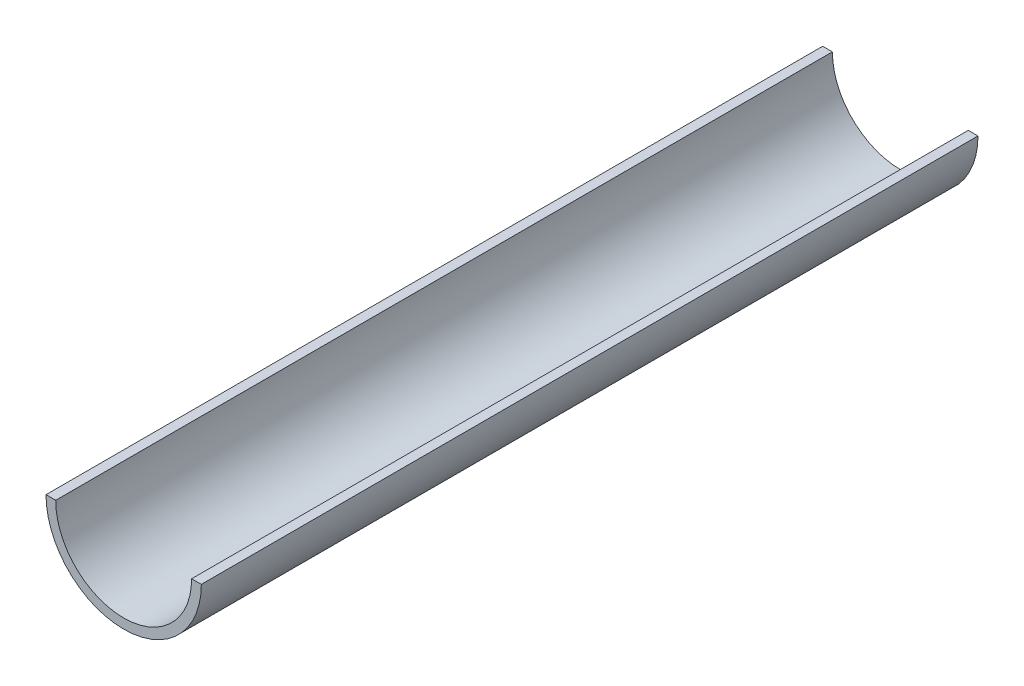
ISO-10303-21;
HEADER;
FILE_DESCRIPTION(('STEP AP214'),'2;1');
FILE_NAME('part.step','',(''),(''),'','','');
FILE_SCHEMA(('AUTOMOTIVE_DESIGN { 1 0 10303 214 1 1 1 1 }'));
ENDSEC;
DATA;
#1=APPLICATION_CONTEXT('core data for automotive mechanical design processes');
#2=APPLICATION_PROTOCOL_DEFINITION('international standard','automotive_design',2000,#1);
#3=PRODUCT_CONTEXT('',#1,'mechanical');
#4=PRODUCT('Part','Part','',(#3));
#5=PRODUCT_RELATED_PRODUCT_CATEGORY('part','',(#4));
#6=PRODUCT_DEFINITION_FORMATION('','',#4);
#7=PRODUCT_DEFINITION_CONTEXT('part definition',#1,'design');
#8=PRODUCT_DEFINITION('design','',#6,#7);
#9=PRODUCT_DEFINITION_SHAPE('','',#8);
#10=(LENGTH_UNIT() NAMED_UNIT(*) SI_UNIT(.MILLI.,.METRE.));
#11=(NAMED_UNIT(*) PLANE_ANGLE_UNIT() SI_UNIT($,.RADIAN.));
#12=(NAMED_UNIT(*) SI_UNIT($,.STERADIAN.) SOLID_ANGLE_UNIT());
#13=UNCERTAINTY_MEASURE_WITH_UNIT(LENGTH_MEASURE(1.E-05),#10,'distance_accuracy_value','');
#14=(GEOMETRIC_REPRESENTATION_CONTEXT(3) GLOBAL_UNCERTAINTY_ASSIGNED_CONTEXT((#13)) GLOBAL_UNIT_ASSIGNED_CONTEXT((#10,
#11,#12)) REPRESENTATION_CONTEXT('',''));
#15=CARTESIAN_POINT('',(0.,0.,0.));
#16=DIRECTION('',(0.,0.,1.));
#17=DIRECTION('',(1.,0.,0.));
#18=AXIS2_PLACEMENT_3D('',#15,#16,#17);
#19=CARTESIAN_POINT('',(0.,0.,0.));
#20=DIRECTION('',(0.,0.,1.));
#21=DIRECTION('',(1.,0.,0.));
#22=AXIS2_PLACEMENT_3D('',#19,#20,#21);
#23=PLANE('',#22);
#24=DIRECTION('',(1.,0.,0.));
#25=VECTOR('',#24,1.);
#26=CARTESIAN_POINT('',(-25.4,0.,0.));
#27=LINE('',#26,#25);
#28=CARTESIAN_POINT('',(22.225,0.,0.));
#29=VERTEX_POINT('',#28);
#30=CARTESIAN_POINT('',(25.4,0.,0.));
#31=VERTEX_POINT('',#30);
#32=EDGE_CURVE('E97',#29,#31,#27,.T.);
#33=ORIENTED_EDGE('',*,*,#32,.T.);
#34=CARTESIAN_POINT('',(0.,0.,0.));
#35=DIRECTION('',(0.,0.,1.));
#36=DIRECTION('',(1.,0.,0.));
#37=AXIS2_PLACEMENT_3D('',#34,#35,#36);
#38=CIRCLE('',#37,25.4);
#39=CARTESIAN_POINT('',(-25.4,0.,0.));
#40=VERTEX_POINT('',#39);
#41=EDGE_CURVE('E40',#40,#31,#38,.T.);
#42=ORIENTED_EDGE('',*,*,#41,.F.);
#43=CARTESIAN_POINT('',(-22.225,0.,0.));
#44=VERTEX_POINT('',#43);
#45=EDGE_CURVE('E98',#40,#44,#27,.T.);
#46=ORIENTED_EDGE('',*,*,#45,.T.);
#47=CARTESIAN_POINT('',(0.,0.,0.));
#48=DIRECTION('',(0.,0.,1.));
#49=DIRECTION('',(1.,0.,0.));
#50=AXIS2_PLACEMENT_3D('',#47,#48,#49);
#51=CIRCLE('',#50,22.225);
#52=EDGE_CURVE('E87',#44,#29,#51,.T.);
#53=ORIENTED_EDGE('',*,*,#52,.T.);
#54=EDGE_LOOP('',(#33,#42,#46,#53));
#55=FACE_BOUND('',#54,.T.);
#56=ADVANCED_FACE('F32',(#55),#23,.F.);
#57=CARTESIAN_POINT('',(0.,0.,914.4));
#58=DIRECTION('',(0.,0.,-1.));
#59=DIRECTION('',(-1.,0.,0.));
#60=AXIS2_PLACEMENT_3D('',#57,#58,#59);
#61=CYLINDRICAL_SURFACE('',#60,25.4);
#62=DIRECTION('',(0.,0.,-1.));
#63=VECTOR('',#62,1.);
#64=CARTESIAN_POINT('',(25.4,0.,254.));
#65=LINE('',#64,#63);
#66=CARTESIAN_POINT('',(25.4,0.,254.));
#67=VERTEX_POINT('',#66);
#68=EDGE_CURVE('E71',#67,#31,#65,.T.);
#69=ORIENTED_EDGE('',*,*,#68,.F.);
#70=CARTESIAN_POINT('',(0.,0.,254.));
#71=DIRECTION('',(0.,0.,-1.));
#72=DIRECTION('',(-1.,0.,0.));
#73=AXIS2_PLACEMENT_3D('',#70,#71,#72);
#74=CIRCLE('',#73,25.4);
#75=CARTESIAN_POINT('',(-25.4,0.,254.));
#76=VERTEX_POINT('',#75);
#77=EDGE_CURVE('E80',#67,#76,#74,.T.);
#78=ORIENTED_EDGE('',*,*,#77,.T.);
#79=DIRECTION('',(0.,0.,-1.));
#80=VECTOR('',#79,1.);
#81=CARTESIAN_POINT('',(-25.4,0.,254.));
#82=LINE('',#81,#80);
#83=EDGE_CURVE('E47',#76,#40,#82,.T.);
#84=ORIENTED_EDGE('',*,*,#83,.T.);
#85=ORIENTED_EDGE('',*,*,#41,.T.);
#86=EDGE_LOOP('',(#69,#78,#84,#85));
#87=FACE_BOUND('',#86,.T.);
#88=ADVANCED_FACE('F34',(#87),#61,.T.);
#89=CARTESIAN_POINT('',(0.,0.,914.4));
#90=DIRECTION('',(0.,0.,-1.));
#91=DIRECTION('',(-1.,0.,0.));
#92=AXIS2_PLACEMENT_3D('',#89,#90,#91);
#93=CYLINDRICAL_SURFACE('',#92,22.225);
#94=CARTESIAN_POINT('',(0.,0.,254.));
#95=DIRECTION('',(0.,0.,-1.));
#96=DIRECTION('',(-1.,0.,0.));
#97=AXIS2_PLACEMENT_3D('',#94,#95,#96);
#98=CIRCLE('',#97,22.225);
#99=CARTESIAN_POINT('',(22.225,0.,254.));
#100=VERTEX_POINT('',#99);
#101=CARTESIAN_POINT('',(-22.225,0.,254.));
#102=VERTEX_POINT('',#101);
#103=EDGE_CURVE('E85',#100,#102,#98,.T.);
#104=ORIENTED_EDGE('',*,*,#103,.F.);
#105=DIRECTION('',(0.,0.,-1.));
#106=VECTOR('',#105,1.);
#107=CARTESIAN_POINT('',(22.225,0.,914.4));
#108=LINE('',#107,#106);
#109=EDGE_CURVE('E54',#100,#29,#108,.T.);
#110=ORIENTED_EDGE('',*,*,#109,.T.);
#111=ORIENTED_EDGE('',*,*,#52,.F.);
#112=DIRECTION('',(0.,0.,-1.));
#113=VECTOR('',#112,1.);
#114=CARTESIAN_POINT('',(-22.225,0.,914.4));
#115=LINE('',#114,#113);
#116=EDGE_CURVE('E88',#44,#102,#115,.F.);
#117=ORIENTED_EDGE('',*,*,#116,.T.);
#118=EDGE_LOOP('',(#104,#110,#111,#117));
#119=FACE_BOUND('',#118,.T.);
#120=ADVANCED_FACE('F101',(#119),#93,.F.);
#121=CARTESIAN_POINT('',(0.,0.,254.));
#122=DIRECTION('',(0.,0.,-1.));
#123=DIRECTION('',(-1.,0.,0.));
#124=AXIS2_PLACEMENT_3D('',#121,#122,#123);
#125=PLANE('',#124);
#126=DIRECTION('',(1.,0.,0.));
#127=VECTOR('',#126,1.);
#128=CARTESIAN_POINT('',(-25.4,0.,254.));
#129=LINE('',#128,#127);
#130=EDGE_CURVE('E82',#76,#102,#129,.T.);
#131=ORIENTED_EDGE('',*,*,#130,.F.);
#132=ORIENTED_EDGE('',*,*,#77,.F.);
#133=DIRECTION('',(1.,0.,0.));
#134=VECTOR('',#133,1.);
#135=CARTESIAN_POINT('',(0.,0.,254.));
#136=LINE('',#135,#134);
#137=EDGE_CURVE('E11',#100,#67,#136,.T.);
#138=ORIENTED_EDGE('',*,*,#137,.F.);
#139=ORIENTED_EDGE('',*,*,#103,.T.);
#140=EDGE_LOOP('',(#131,#132,#138,#139));
#141=FACE_BOUND('',#140,.T.);
#142=ADVANCED_FACE('F84',(#141),#125,.F.);
#143=CARTESIAN_POINT('',(-25.4,0.,254.));
#144=DIRECTION('',(0.,1.,0.));
#145=DIRECTION('',(0.,0.,1.));
#146=AXIS2_PLACEMENT_3D('',#143,#144,#145);
#147=PLANE('',#146);
#148=ORIENTED_EDGE('',*,*,#137,.T.);
#149=ORIENTED_EDGE('',*,*,#68,.T.);
#150=ORIENTED_EDGE('',*,*,#32,.F.);
#151=ORIENTED_EDGE('',*,*,#109,.F.);
#152=EDGE_LOOP('',(#148,#149,#150,#151));
#153=FACE_BOUND('',#152,.T.);
#154=ADVANCED_FACE('F70',(#153),#147,.T.);
#155=ORIENTED_EDGE('',*,*,#45,.F.);
#156=ORIENTED_EDGE('',*,*,#83,.F.);
#157=ORIENTED_EDGE('',*,*,#130,.T.);
#158=ORIENTED_EDGE('',*,*,#116,.F.);
#159=EDGE_LOOP('',(#155,#156,#157,#158));
#160=FACE_BOUND('',#159,.T.);
#161=ADVANCED_FACE('F105',(#160),#147,.T.);
#162=CLOSED_SHELL('',(#56,#88,#120,#142,#154,#161));
#163=MANIFOLD_SOLID_BREP('B2',#162);
#164=ADVANCED_BREP_SHAPE_REPRESENTATION('',(#18,#163),#14);
#165=SHAPE_DEFINITION_REPRESENTATION(#9,#164);
ENDSEC;
END-ISO-10303-21;
